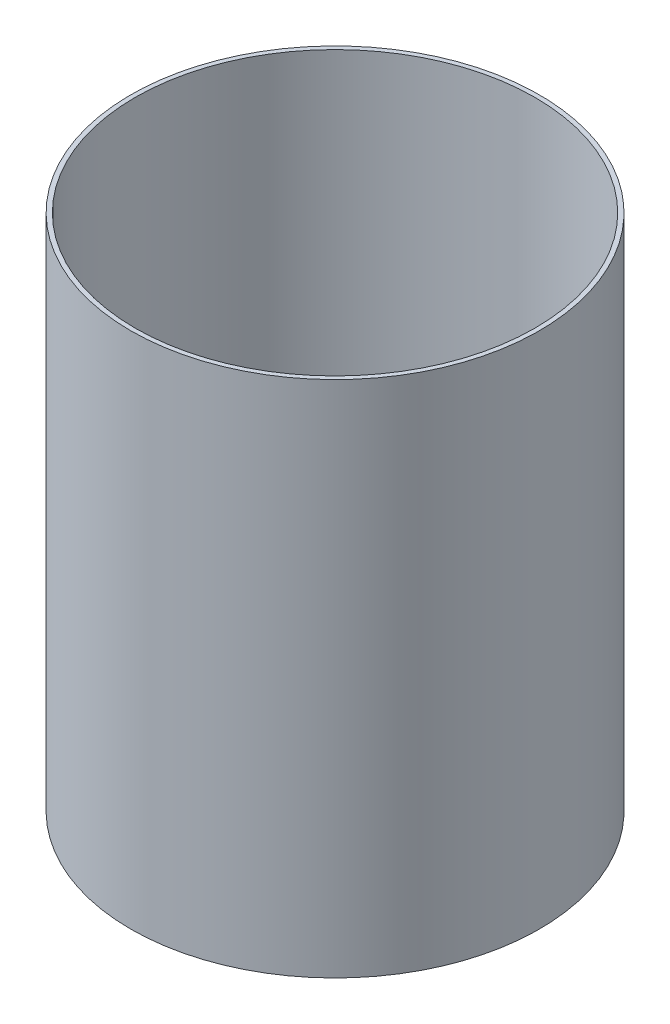
ISO-10303-21;
HEADER;
FILE_DESCRIPTION(('STEP AP214'),'2;1');
FILE_NAME('part.step','',(''),(''),'','','');
FILE_SCHEMA(('AUTOMOTIVE_DESIGN { 1 0 10303 214 1 1 1 1 }'));
ENDSEC;
DATA;
#1=APPLICATION_CONTEXT('core data for automotive mechanical design processes');
#2=APPLICATION_PROTOCOL_DEFINITION('international standard','automotive_design',2000,#1);
#3=PRODUCT_CONTEXT('',#1,'mechanical');
#4=PRODUCT('Part','Part','',(#3));
#5=PRODUCT_RELATED_PRODUCT_CATEGORY('part','',(#4));
#6=PRODUCT_DEFINITION_FORMATION('','',#4);
#7=PRODUCT_DEFINITION_CONTEXT('part definition',#1,'design');
#8=PRODUCT_DEFINITION('design','',#6,#7);
#9=PRODUCT_DEFINITION_SHAPE('','',#8);
#10=(LENGTH_UNIT() NAMED_UNIT(*) SI_UNIT(.MILLI.,.METRE.));
#11=(NAMED_UNIT(*) PLANE_ANGLE_UNIT() SI_UNIT($,.RADIAN.));
#12=(NAMED_UNIT(*) SI_UNIT($,.STERADIAN.) SOLID_ANGLE_UNIT());
#13=UNCERTAINTY_MEASURE_WITH_UNIT(LENGTH_MEASURE(1.E-05),#10,'distance_accuracy_value','');
#14=(GEOMETRIC_REPRESENTATION_CONTEXT(3) GLOBAL_UNCERTAINTY_ASSIGNED_CONTEXT((#13)) GLOBAL_UNIT_ASSIGNED_CONTEXT((#10,
#11,#12)) REPRESENTATION_CONTEXT('',''));
#15=CARTESIAN_POINT('',(0.,0.,0.));
#16=DIRECTION('',(0.,0.,1.));
#17=DIRECTION('',(1.,0.,0.));
#18=AXIS2_PLACEMENT_3D('',#15,#16,#17);
#19=CARTESIAN_POINT('',(0.,875.,0.));
#20=DIRECTION('',(0.,-1.,0.));
#21=DIRECTION('',(0.,0.,-1.));
#22=AXIS2_PLACEMENT_3D('',#19,#20,#21);
#23=CYLINDRICAL_SURFACE('',#22,690.);
#24=CARTESIAN_POINT('',(0.,875.,0.));
#25=DIRECTION('',(0.,1.,0.));
#26=DIRECTION('',(0.,0.,1.));
#27=AXIS2_PLACEMENT_3D('',#24,#25,#26);
#28=CIRCLE('',#27,690.);
#29=CARTESIAN_POINT('',(0.,875.,690.));
#30=VERTEX_POINT('',#29);
#31=EDGE_CURVE('E10',#30,#30,#28,.T.);
#32=ORIENTED_EDGE('',*,*,#31,.F.);
#33=EDGE_LOOP('',(#32));
#34=FACE_BOUND('',#33,.T.);
#35=CARTESIAN_POINT('',(0.,-875.,0.));
#36=DIRECTION('',(0.,1.,0.));
#37=DIRECTION('',(0.,0.,1.));
#38=AXIS2_PLACEMENT_3D('',#35,#36,#37);
#39=CIRCLE('',#38,690.);
#40=CARTESIAN_POINT('',(0.,-875.,690.));
#41=VERTEX_POINT('',#40);
#42=EDGE_CURVE('E40',#41,#41,#39,.T.);
#43=ORIENTED_EDGE('',*,*,#42,.T.);
#44=EDGE_LOOP('',(#43));
#45=FACE_BOUND('',#44,.T.);
#46=ADVANCED_FACE('F37',(#34,#45),#23,.T.);
#47=CARTESIAN_POINT('',(0.,875.,0.));
#48=DIRECTION('',(0.,1.,0.));
#49=DIRECTION('',(0.,0.,1.));
#50=AXIS2_PLACEMENT_3D('',#47,#48,#49);
#51=PLANE('',#50);
#52=CARTESIAN_POINT('',(0.,875.,0.));
#53=DIRECTION('',(0.,1.,0.));
#54=DIRECTION('',(0.,0.,1.));
#55=AXIS2_PLACEMENT_3D('',#52,#53,#54);
#56=CIRCLE('',#55,675.);
#57=CARTESIAN_POINT('',(0.,875.,675.));
#58=VERTEX_POINT('',#57);
#59=EDGE_CURVE('E51',#58,#58,#56,.T.);
#60=ORIENTED_EDGE('',*,*,#59,.F.);
#61=EDGE_LOOP('',(#60));
#62=FACE_BOUND('',#61,.T.);
#63=ORIENTED_EDGE('',*,*,#31,.T.);
#64=EDGE_LOOP('',(#63));
#65=FACE_BOUND('',#64,.T.);
#66=ADVANCED_FACE('F57',(#62,#65),#51,.T.);
#67=CARTESIAN_POINT('',(0.,-875.,0.));
#68=DIRECTION('',(0.,1.,0.));
#69=DIRECTION('',(0.,0.,1.));
#70=AXIS2_PLACEMENT_3D('',#67,#68,#69);
#71=PLANE('',#70);
#72=CARTESIAN_POINT('',(0.,-875.,0.));
#73=DIRECTION('',(0.,1.,0.));
#74=DIRECTION('',(0.,0.,1.));
#75=AXIS2_PLACEMENT_3D('',#72,#73,#74);
#76=CIRCLE('',#75,675.);
#77=CARTESIAN_POINT('',(0.,-875.,675.));
#78=VERTEX_POINT('',#77);
#79=EDGE_CURVE('E47',#78,#78,#76,.T.);
#80=ORIENTED_EDGE('',*,*,#79,.T.);
#81=EDGE_LOOP('',(#80));
#82=FACE_BOUND('',#81,.T.);
#83=ORIENTED_EDGE('',*,*,#42,.F.);
#84=EDGE_LOOP('',(#83));
#85=FACE_BOUND('',#84,.T.);
#86=ADVANCED_FACE('F59',(#82,#85),#71,.F.);
#87=CARTESIAN_POINT('',(0.,-875.,0.));
#88=DIRECTION('',(0.,1.,0.));
#89=DIRECTION('',(0.,0.,1.));
#90=AXIS2_PLACEMENT_3D('',#87,#88,#89);
#91=CYLINDRICAL_SURFACE('',#90,675.);
#92=ORIENTED_EDGE('',*,*,#79,.F.);
#93=EDGE_LOOP('',(#92));
#94=FACE_BOUND('',#93,.T.);
#95=ORIENTED_EDGE('',*,*,#59,.T.);
#96=EDGE_LOOP('',(#95));
#97=FACE_BOUND('',#96,.T.);
#98=ADVANCED_FACE('F55',(#94,#97),#91,.F.);
#99=CLOSED_SHELL('',(#46,#66,#86,#98));
#100=MANIFOLD_SOLID_BREP('B2',#99);
#101=ADVANCED_BREP_SHAPE_REPRESENTATION('',(#18,#100),#14);
#102=SHAPE_DEFINITION_REPRESENTATION(#9,#101);
ENDSEC;
END-ISO-10303-21;
